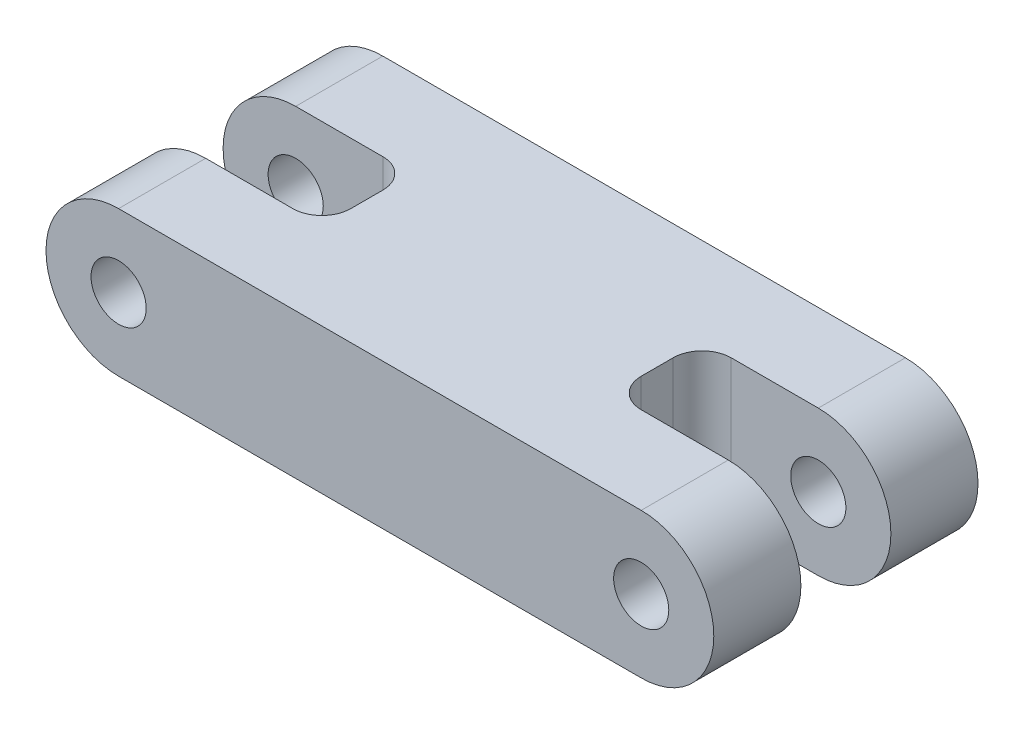
ISO-10303-21;
HEADER;
FILE_DESCRIPTION(('STEP AP214'),'2;1');
FILE_NAME('part.step','',(''),(''),'','','');
FILE_SCHEMA(('AUTOMOTIVE_DESIGN { 1 0 10303 214 1 1 1 1 }'));
ENDSEC;
DATA;
#1=APPLICATION_CONTEXT('core data for automotive mechanical design processes');
#2=APPLICATION_PROTOCOL_DEFINITION('international standard','automotive_design',2000,#1);
#3=PRODUCT_CONTEXT('',#1,'mechanical');
#4=PRODUCT('Part','Part','',(#3));
#5=PRODUCT_RELATED_PRODUCT_CATEGORY('part','',(#4));
#6=PRODUCT_DEFINITION_FORMATION('','',#4);
#7=PRODUCT_DEFINITION_CONTEXT('part definition',#1,'design');
#8=PRODUCT_DEFINITION('design','',#6,#7);
#9=PRODUCT_DEFINITION_SHAPE('','',#8);
#10=(LENGTH_UNIT() NAMED_UNIT(*) SI_UNIT(.MILLI.,.METRE.));
#11=(NAMED_UNIT(*) PLANE_ANGLE_UNIT() SI_UNIT($,.RADIAN.));
#12=(NAMED_UNIT(*) SI_UNIT($,.STERADIAN.) SOLID_ANGLE_UNIT());
#13=UNCERTAINTY_MEASURE_WITH_UNIT(LENGTH_MEASURE(1.E-05),#10,'distance_accuracy_value','');
#14=(GEOMETRIC_REPRESENTATION_CONTEXT(3) GLOBAL_UNCERTAINTY_ASSIGNED_CONTEXT((#13)) GLOBAL_UNIT_ASSIGNED_CONTEXT((#10,
#11,#12)) REPRESENTATION_CONTEXT('',''));
#15=CARTESIAN_POINT('',(0.,0.,0.));
#16=DIRECTION('',(0.,0.,1.));
#17=DIRECTION('',(1.,0.,0.));
#18=AXIS2_PLACEMENT_3D('',#15,#16,#17);
#19=CARTESIAN_POINT('',(0.,0.,-3.1));
#20=DIRECTION('',(0.,0.,-1.));
#21=DIRECTION('',(-1.,0.,0.));
#22=AXIS2_PLACEMENT_3D('',#19,#20,#21);
#23=PLANE('',#22);
#24=CARTESIAN_POINT('',(0.,0.,-3.1));
#25=DIRECTION('',(0.,0.,1.));
#26=DIRECTION('',(1.,0.,0.));
#27=AXIS2_PLACEMENT_3D('',#24,#25,#26);
#28=CIRCLE('',#27,1.9);
#29=CARTESIAN_POINT('',(1.9,0.,-3.1));
#30=VERTEX_POINT('',#29);
#31=EDGE_CURVE('E214',#30,#30,#28,.T.);
#32=ORIENTED_EDGE('',*,*,#31,.F.);
#33=EDGE_LOOP('',(#32));
#34=FACE_BOUND('',#33,.T.);
#35=DIRECTION('',(-1.,0.,0.));
#36=VECTOR('',#35,1.);
#37=CARTESIAN_POINT('',(0.,5.,-3.1));
#38=LINE('',#37,#36);
#39=CARTESIAN_POINT('',(0.,5.,-3.1));
#40=VERTEX_POINT('',#39);
#41=CARTESIAN_POINT('',(-6.,5.,-3.1));
#42=VERTEX_POINT('',#41);
#43=EDGE_CURVE('E232',#40,#42,#38,.T.);
#44=ORIENTED_EDGE('',*,*,#43,.T.);
#45=DIRECTION('',(0.,1.,0.));
#46=VECTOR('',#45,1.);
#47=CARTESIAN_POINT('',(-6.,-5.,-3.1));
#48=LINE('',#47,#46);
#49=CARTESIAN_POINT('',(-6.,-5.,-3.1));
#50=VERTEX_POINT('',#49);
#51=EDGE_CURVE('E60',#42,#50,#48,.F.);
#52=ORIENTED_EDGE('',*,*,#51,.T.);
#53=DIRECTION('',(1.,0.,0.));
#54=VECTOR('',#53,1.);
#55=CARTESIAN_POINT('',(0.,-5.,-3.1));
#56=LINE('',#55,#54);
#57=CARTESIAN_POINT('',(0.,-5.,-3.1));
#58=VERTEX_POINT('',#57);
#59=EDGE_CURVE('E236',#50,#58,#56,.T.);
#60=ORIENTED_EDGE('',*,*,#59,.T.);
#61=CARTESIAN_POINT('',(0.,0.,-3.1));
#62=DIRECTION('',(0.,0.,1.));
#63=DIRECTION('',(-1.,0.,0.));
#64=AXIS2_PLACEMENT_3D('',#61,#62,#63);
#65=CIRCLE('',#64,5.);
#66=EDGE_CURVE('E227',#58,#40,#65,.T.);
#67=ORIENTED_EDGE('',*,*,#66,.T.);
#68=EDGE_LOOP('',(#44,#52,#60,#67));
#69=FACE_BOUND('',#68,.T.);
#70=ADVANCED_FACE('F39',(#34,#69),#23,.F.);
#71=CARTESIAN_POINT('',(-36.,0.,-3.1));
#72=DIRECTION('',(0.,0.,1.));
#73=DIRECTION('',(1.,0.,0.));
#74=AXIS2_PLACEMENT_3D('',#71,#72,#73);
#75=CIRCLE('',#74,1.9);
#76=CARTESIAN_POINT('',(-34.1,0.,-3.1));
#77=VERTEX_POINT('',#76);
#78=EDGE_CURVE('E224',#77,#77,#75,.T.);
#79=ORIENTED_EDGE('',*,*,#78,.F.);
#80=EDGE_LOOP('',(#79));
#81=FACE_BOUND('',#80,.T.);
#82=CARTESIAN_POINT('',(-36.,-5.,-3.1));
#83=VERTEX_POINT('',#82);
#84=CARTESIAN_POINT('',(-30.,-5.,-3.1));
#85=VERTEX_POINT('',#84);
#86=EDGE_CURVE('E237',#83,#85,#56,.T.);
#87=ORIENTED_EDGE('',*,*,#86,.T.);
#88=DIRECTION('',(0.,-1.,0.));
#89=VECTOR('',#88,1.);
#90=CARTESIAN_POINT('',(-30.,5.,-3.1));
#91=LINE('',#90,#89);
#92=CARTESIAN_POINT('',(-30.,5.,-3.1));
#93=VERTEX_POINT('',#92);
#94=EDGE_CURVE('E269',#85,#93,#91,.F.);
#95=ORIENTED_EDGE('',*,*,#94,.T.);
#96=CARTESIAN_POINT('',(-36.,5.,-3.1));
#97=VERTEX_POINT('',#96);
#98=EDGE_CURVE('E230',#93,#97,#38,.T.);
#99=ORIENTED_EDGE('',*,*,#98,.T.);
#100=CARTESIAN_POINT('',(-36.,0.,-3.1));
#101=DIRECTION('',(0.,0.,1.));
#102=DIRECTION('',(1.,0.,0.));
#103=AXIS2_PLACEMENT_3D('',#100,#101,#102);
#104=CIRCLE('',#103,5.);
#105=EDGE_CURVE('E234',#97,#83,#104,.T.);
#106=ORIENTED_EDGE('',*,*,#105,.T.);
#107=EDGE_LOOP('',(#87,#95,#99,#106));
#108=FACE_BOUND('',#107,.T.);
#109=ADVANCED_FACE('F321',(#81,#108),#23,.F.);
#110=CARTESIAN_POINT('',(0.,0.,-3.1));
#111=DIRECTION('',(0.,0.,-1.));
#112=DIRECTION('',(-1.,0.,0.));
#113=AXIS2_PLACEMENT_3D('',#110,#111,#112);
#114=CYLINDRICAL_SURFACE('',#113,5.);
#115=CARTESIAN_POINT('',(0.,0.,-9.1));
#116=DIRECTION('',(0.,0.,1.));
#117=DIRECTION('',(-1.,0.,0.));
#118=AXIS2_PLACEMENT_3D('',#115,#116,#117);
#119=CIRCLE('',#118,5.);
#120=CARTESIAN_POINT('',(0.,-5.,-9.1));
#121=VERTEX_POINT('',#120);
#122=CARTESIAN_POINT('',(0.,5.,-9.1));
#123=VERTEX_POINT('',#122);
#124=EDGE_CURVE('E223',#121,#123,#119,.T.);
#125=ORIENTED_EDGE('',*,*,#124,.T.);
#126=DIRECTION('',(0.,0.,-1.));
#127=VECTOR('',#126,1.);
#128=CARTESIAN_POINT('',(0.,5.,-3.1));
#129=LINE('',#128,#127);
#130=EDGE_CURVE('E256',#40,#123,#129,.T.);
#131=ORIENTED_EDGE('',*,*,#130,.F.);
#132=ORIENTED_EDGE('',*,*,#66,.F.);
#133=DIRECTION('',(0.,0.,-1.));
#134=VECTOR('',#133,1.);
#135=CARTESIAN_POINT('',(0.,-5.,-3.1));
#136=LINE('',#135,#134);
#137=EDGE_CURVE('E240',#58,#121,#136,.T.);
#138=ORIENTED_EDGE('',*,*,#137,.T.);
#139=EDGE_LOOP('',(#125,#131,#132,#138));
#140=FACE_BOUND('',#139,.T.);
#141=ADVANCED_FACE('F306',(#140),#114,.T.);
#142=CARTESIAN_POINT('',(0.,5.,-3.1));
#143=DIRECTION('',(0.,-1.,0.));
#144=DIRECTION('',(1.,0.,0.));
#145=AXIS2_PLACEMENT_3D('',#142,#143,#144);
#146=PLANE('',#145);
#147=DIRECTION('',(-1.,0.,0.));
#148=VECTOR('',#147,1.);
#149=CARTESIAN_POINT('',(0.,5.,-9.1));
#150=LINE('',#149,#148);
#151=CARTESIAN_POINT('',(-36.,5.,-9.1));
#152=VERTEX_POINT('',#151);
#153=EDGE_CURVE('E243',#123,#152,#150,.T.);
#154=ORIENTED_EDGE('',*,*,#153,.T.);
#155=DIRECTION('',(0.,0.,-1.));
#156=VECTOR('',#155,1.);
#157=CARTESIAN_POINT('',(-36.,5.,-3.1));
#158=LINE('',#157,#156);
#159=EDGE_CURVE('E253',#97,#152,#158,.T.);
#160=ORIENTED_EDGE('',*,*,#159,.F.);
#161=ORIENTED_EDGE('',*,*,#98,.F.);
#162=CARTESIAN_POINT('',(-30.,5.,-1.1));
#163=DIRECTION('',(0.,-1.,0.));
#164=DIRECTION('',(1.,0.,0.));
#165=AXIS2_PLACEMENT_3D('',#162,#163,#164);
#166=CIRCLE('',#165,2.);
#167=CARTESIAN_POINT('',(-28.,5.,-1.1));
#168=VERTEX_POINT('',#167);
#169=EDGE_CURVE('E284',#93,#168,#166,.T.);
#170=ORIENTED_EDGE('',*,*,#169,.T.);
#171=DIRECTION('',(0.,0.,-1.));
#172=VECTOR('',#171,1.);
#173=CARTESIAN_POINT('',(-28.,5.,22.3606797749979));
#174=LINE('',#173,#172);
#175=CARTESIAN_POINT('',(-28.,5.,1.1));
#176=VERTEX_POINT('',#175);
#177=EDGE_CURVE('E208',#176,#168,#174,.T.);
#178=ORIENTED_EDGE('',*,*,#177,.F.);
#179=CARTESIAN_POINT('',(-30.,5.,1.1));
#180=DIRECTION('',(0.,-1.,0.));
#181=DIRECTION('',(1.,0.,0.));
#182=AXIS2_PLACEMENT_3D('',#179,#180,#181);
#183=CIRCLE('',#182,2.);
#184=CARTESIAN_POINT('',(-30.,5.,3.1));
#185=VERTEX_POINT('',#184);
#186=EDGE_CURVE('E280',#176,#185,#183,.T.);
#187=ORIENTED_EDGE('',*,*,#186,.T.);
#188=DIRECTION('',(-1.,0.,0.));
#189=VECTOR('',#188,1.);
#190=CARTESIAN_POINT('',(0.,5.,3.1));
#191=LINE('',#190,#189);
#192=CARTESIAN_POINT('',(-36.,5.,3.1));
#193=VERTEX_POINT('',#192);
#194=EDGE_CURVE('E171',#185,#193,#191,.T.);
#195=ORIENTED_EDGE('',*,*,#194,.T.);
#196=DIRECTION('',(0.,0.,1.));
#197=VECTOR('',#196,1.);
#198=CARTESIAN_POINT('',(-36.,5.,3.1));
#199=LINE('',#198,#197);
#200=CARTESIAN_POINT('',(-36.,5.,9.1));
#201=VERTEX_POINT('',#200);
#202=EDGE_CURVE('E161',#193,#201,#199,.T.);
#203=ORIENTED_EDGE('',*,*,#202,.T.);
#204=DIRECTION('',(-1.,0.,0.));
#205=VECTOR('',#204,1.);
#206=CARTESIAN_POINT('',(0.,5.,9.1));
#207=LINE('',#206,#205);
#208=CARTESIAN_POINT('',(0.,5.,9.1));
#209=VERTEX_POINT('',#208);
#210=EDGE_CURVE('E156',#209,#201,#207,.T.);
#211=ORIENTED_EDGE('',*,*,#210,.F.);
#212=DIRECTION('',(0.,0.,1.));
#213=VECTOR('',#212,1.);
#214=CARTESIAN_POINT('',(0.,5.,3.1));
#215=LINE('',#214,#213);
#216=CARTESIAN_POINT('',(0.,5.,3.1));
#217=VERTEX_POINT('',#216);
#218=EDGE_CURVE('E149',#217,#209,#215,.T.);
#219=ORIENTED_EDGE('',*,*,#218,.F.);
#220=CARTESIAN_POINT('',(-6.,5.,3.1));
#221=VERTEX_POINT('',#220);
#222=EDGE_CURVE('E153',#217,#221,#191,.T.);
#223=ORIENTED_EDGE('',*,*,#222,.T.);
#224=CARTESIAN_POINT('',(-6.,5.,1.1));
#225=DIRECTION('',(0.,-1.,0.));
#226=DIRECTION('',(1.,0.,0.));
#227=AXIS2_PLACEMENT_3D('',#224,#225,#226);
#228=CIRCLE('',#227,2.);
#229=CARTESIAN_POINT('',(-8.,5.,1.1));
#230=VERTEX_POINT('',#229);
#231=EDGE_CURVE('E286',#221,#230,#228,.T.);
#232=ORIENTED_EDGE('',*,*,#231,.T.);
#233=DIRECTION('',(0.,0.,-1.));
#234=VECTOR('',#233,1.);
#235=CARTESIAN_POINT('',(-8.,5.,22.3606797749979));
#236=LINE('',#235,#234);
#237=CARTESIAN_POINT('',(-8.,5.,-1.1));
#238=VERTEX_POINT('',#237);
#239=EDGE_CURVE('E206',#230,#238,#236,.T.);
#240=ORIENTED_EDGE('',*,*,#239,.T.);
#241=CARTESIAN_POINT('',(-6.,5.,-1.1));
#242=DIRECTION('',(0.,-1.,0.));
#243=DIRECTION('',(1.,0.,0.));
#244=AXIS2_PLACEMENT_3D('',#241,#242,#243);
#245=CIRCLE('',#244,2.);
#246=EDGE_CURVE('E47',#238,#42,#245,.T.);
#247=ORIENTED_EDGE('',*,*,#246,.T.);
#248=ORIENTED_EDGE('',*,*,#43,.F.);
#249=ORIENTED_EDGE('',*,*,#130,.T.);
#250=EDGE_LOOP('',(#154,#160,#161,#170,#178,#187,#195,#203,#211,#219,#223,#232,#240,#247,#248,#249));
#251=FACE_BOUND('',#250,.T.);
#252=ADVANCED_FACE('F151',(#251),#146,.F.);
#253=CARTESIAN_POINT('',(-36.,0.,-3.1));
#254=DIRECTION('',(0.,0.,-1.));
#255=DIRECTION('',(-1.,0.,0.));
#256=AXIS2_PLACEMENT_3D('',#253,#254,#255);
#257=CYLINDRICAL_SURFACE('',#256,5.);
#258=CARTESIAN_POINT('',(-36.,0.,-9.1));
#259=DIRECTION('',(0.,0.,1.));
#260=DIRECTION('',(1.,0.,0.));
#261=AXIS2_PLACEMENT_3D('',#258,#259,#260);
#262=CIRCLE('',#261,5.);
#263=CARTESIAN_POINT('',(-36.,-5.,-9.1));
#264=VERTEX_POINT('',#263);
#265=EDGE_CURVE('E245',#152,#264,#262,.T.);
#266=ORIENTED_EDGE('',*,*,#265,.T.);
#267=DIRECTION('',(0.,0.,-1.));
#268=VECTOR('',#267,1.);
#269=CARTESIAN_POINT('',(-36.,-5.,-3.1));
#270=LINE('',#269,#268);
#271=EDGE_CURVE('E250',#83,#264,#270,.T.);
#272=ORIENTED_EDGE('',*,*,#271,.F.);
#273=ORIENTED_EDGE('',*,*,#105,.F.);
#274=ORIENTED_EDGE('',*,*,#159,.T.);
#275=EDGE_LOOP('',(#266,#272,#273,#274));
#276=FACE_BOUND('',#275,.T.);
#277=ADVANCED_FACE('F314',(#276),#257,.T.);
#278=CARTESIAN_POINT('',(0.,-5.,-3.1));
#279=DIRECTION('',(0.,1.,0.));
#280=DIRECTION('',(-1.,0.,0.));
#281=AXIS2_PLACEMENT_3D('',#278,#279,#280);
#282=PLANE('',#281);
#283=DIRECTION('',(1.,0.,0.));
#284=VECTOR('',#283,1.);
#285=CARTESIAN_POINT('',(0.,-5.,-9.1));
#286=LINE('',#285,#284);
#287=EDGE_CURVE('E231',#264,#121,#286,.T.);
#288=ORIENTED_EDGE('',*,*,#287,.T.);
#289=ORIENTED_EDGE('',*,*,#137,.F.);
#290=ORIENTED_EDGE('',*,*,#59,.F.);
#291=CARTESIAN_POINT('',(-6.,-5.,-1.1));
#292=DIRECTION('',(0.,1.,0.));
#293=DIRECTION('',(-1.,0.,0.));
#294=AXIS2_PLACEMENT_3D('',#291,#292,#293);
#295=CIRCLE('',#294,2.);
#296=CARTESIAN_POINT('',(-8.,-5.,-1.1));
#297=VERTEX_POINT('',#296);
#298=EDGE_CURVE('E11',#50,#297,#295,.T.);
#299=ORIENTED_EDGE('',*,*,#298,.T.);
#300=DIRECTION('',(0.,0.,-1.));
#301=VECTOR('',#300,1.);
#302=CARTESIAN_POINT('',(-8.,-5.,22.3606797749979));
#303=LINE('',#302,#301);
#304=CARTESIAN_POINT('',(-8.,-5.,1.1));
#305=VERTEX_POINT('',#304);
#306=EDGE_CURVE('E160',#305,#297,#303,.T.);
#307=ORIENTED_EDGE('',*,*,#306,.F.);
#308=CARTESIAN_POINT('',(-6.,-5.,1.1));
#309=DIRECTION('',(0.,1.,0.));
#310=DIRECTION('',(-1.,0.,0.));
#311=AXIS2_PLACEMENT_3D('',#308,#309,#310);
#312=CIRCLE('',#311,2.);
#313=CARTESIAN_POINT('',(-6.,-5.,3.1));
#314=VERTEX_POINT('',#313);
#315=EDGE_CURVE('E288',#305,#314,#312,.T.);
#316=ORIENTED_EDGE('',*,*,#315,.T.);
#317=DIRECTION('',(1.,0.,0.));
#318=VECTOR('',#317,1.);
#319=CARTESIAN_POINT('',(0.,-5.,3.1));
#320=LINE('',#319,#318);
#321=CARTESIAN_POINT('',(0.,-5.,3.1));
#322=VERTEX_POINT('',#321);
#323=EDGE_CURVE('E181',#314,#322,#320,.T.);
#324=ORIENTED_EDGE('',*,*,#323,.T.);
#325=DIRECTION('',(0.,0.,1.));
#326=VECTOR('',#325,1.);
#327=CARTESIAN_POINT('',(0.,-5.,3.1));
#328=LINE('',#327,#326);
#329=CARTESIAN_POINT('',(0.,-5.,9.1));
#330=VERTEX_POINT('',#329);
#331=EDGE_CURVE('E168',#322,#330,#328,.T.);
#332=ORIENTED_EDGE('',*,*,#331,.T.);
#333=DIRECTION('',(1.,0.,0.));
#334=VECTOR('',#333,1.);
#335=CARTESIAN_POINT('',(0.,-5.,9.1));
#336=LINE('',#335,#334);
#337=CARTESIAN_POINT('',(-36.,-5.,9.1));
#338=VERTEX_POINT('',#337);
#339=EDGE_CURVE('E172',#338,#330,#336,.T.);
#340=ORIENTED_EDGE('',*,*,#339,.F.);
#341=DIRECTION('',(0.,0.,1.));
#342=VECTOR('',#341,1.);
#343=CARTESIAN_POINT('',(-36.,-5.,3.1));
#344=LINE('',#343,#342);
#345=CARTESIAN_POINT('',(-36.,-5.,3.1));
#346=VERTEX_POINT('',#345);
#347=EDGE_CURVE('E197',#346,#338,#344,.T.);
#348=ORIENTED_EDGE('',*,*,#347,.F.);
#349=CARTESIAN_POINT('',(-30.,-5.,3.1));
#350=VERTEX_POINT('',#349);
#351=EDGE_CURVE('E185',#346,#350,#320,.T.);
#352=ORIENTED_EDGE('',*,*,#351,.T.);
#353=CARTESIAN_POINT('',(-30.,-5.,1.1));
#354=DIRECTION('',(0.,1.,0.));
#355=DIRECTION('',(-1.,0.,0.));
#356=AXIS2_PLACEMENT_3D('',#353,#354,#355);
#357=CIRCLE('',#356,2.);
#358=CARTESIAN_POINT('',(-28.,-5.,1.1));
#359=VERTEX_POINT('',#358);
#360=EDGE_CURVE('E278',#350,#359,#357,.T.);
#361=ORIENTED_EDGE('',*,*,#360,.T.);
#362=DIRECTION('',(0.,0.,-1.));
#363=VECTOR('',#362,1.);
#364=CARTESIAN_POINT('',(-28.,-5.,22.3606797749979));
#365=LINE('',#364,#363);
#366=CARTESIAN_POINT('',(-28.,-5.,-1.1));
#367=VERTEX_POINT('',#366);
#368=EDGE_CURVE('E211',#359,#367,#365,.T.);
#369=ORIENTED_EDGE('',*,*,#368,.T.);
#370=CARTESIAN_POINT('',(-30.,-5.,-1.1));
#371=DIRECTION('',(0.,1.,0.));
#372=DIRECTION('',(-1.,0.,0.));
#373=AXIS2_PLACEMENT_3D('',#370,#371,#372);
#374=CIRCLE('',#373,2.);
#375=EDGE_CURVE('E282',#367,#85,#374,.T.);
#376=ORIENTED_EDGE('',*,*,#375,.T.);
#377=ORIENTED_EDGE('',*,*,#86,.F.);
#378=ORIENTED_EDGE('',*,*,#271,.T.);
#379=EDGE_LOOP('',(#288,#289,#290,#299,#307,#316,#324,#332,#340,#348,#352,#361,#369,#376,#377,#378));
#380=FACE_BOUND('',#379,.T.);
#381=ADVANCED_FACE('F292',(#380),#282,.F.);
#382=CARTESIAN_POINT('',(0.,0.,-9.1));
#383=DIRECTION('',(0.,0.,-1.));
#384=DIRECTION('',(-1.,0.,0.));
#385=AXIS2_PLACEMENT_3D('',#382,#383,#384);
#386=PLANE('',#385);
#387=CARTESIAN_POINT('',(0.,0.,-9.1));
#388=DIRECTION('',(0.,0.,-1.));
#389=DIRECTION('',(-1.,0.,0.));
#390=AXIS2_PLACEMENT_3D('',#387,#388,#389);
#391=CIRCLE('',#390,1.9);
#392=CARTESIAN_POINT('',(-1.9,0.,-9.1));
#393=VERTEX_POINT('',#392);
#394=EDGE_CURVE('E219',#393,#393,#391,.T.);
#395=ORIENTED_EDGE('',*,*,#394,.F.);
#396=EDGE_LOOP('',(#395));
#397=FACE_BOUND('',#396,.T.);
#398=CARTESIAN_POINT('',(-36.,0.,-9.1));
#399=DIRECTION('',(0.,0.,1.));
#400=DIRECTION('',(1.,0.,0.));
#401=AXIS2_PLACEMENT_3D('',#398,#399,#400);
#402=CIRCLE('',#401,1.9);
#403=CARTESIAN_POINT('',(-34.1,0.,-9.1));
#404=VERTEX_POINT('',#403);
#405=EDGE_CURVE('E220',#404,#404,#402,.T.);
#406=ORIENTED_EDGE('',*,*,#405,.T.);
#407=EDGE_LOOP('',(#406));
#408=FACE_BOUND('',#407,.T.);
#409=ORIENTED_EDGE('',*,*,#124,.F.);
#410=ORIENTED_EDGE('',*,*,#287,.F.);
#411=ORIENTED_EDGE('',*,*,#265,.F.);
#412=ORIENTED_EDGE('',*,*,#153,.F.);
#413=EDGE_LOOP('',(#409,#410,#411,#412));
#414=FACE_BOUND('',#413,.T.);
#415=ADVANCED_FACE('F317',(#397,#408,#414),#386,.T.);
#416=CARTESIAN_POINT('',(-36.,0.,-9.1));
#417=DIRECTION('',(0.,0.,1.));
#418=DIRECTION('',(1.,0.,0.));
#419=AXIS2_PLACEMENT_3D('',#416,#417,#418);
#420=CYLINDRICAL_SURFACE('',#419,1.9);
#421=ORIENTED_EDGE('',*,*,#405,.F.);
#422=EDGE_LOOP('',(#421));
#423=FACE_BOUND('',#422,.T.);
#424=ORIENTED_EDGE('',*,*,#78,.T.);
#425=EDGE_LOOP('',(#424));
#426=FACE_BOUND('',#425,.T.);
#427=ADVANCED_FACE('F369',(#423,#426),#420,.F.);
#428=CARTESIAN_POINT('',(0.,0.,-13.1));
#429=DIRECTION('',(0.,0.,1.));
#430=DIRECTION('',(1.,0.,0.));
#431=AXIS2_PLACEMENT_3D('',#428,#429,#430);
#432=CYLINDRICAL_SURFACE('',#431,1.9);
#433=ORIENTED_EDGE('',*,*,#394,.T.);
#434=EDGE_LOOP('',(#433));
#435=FACE_BOUND('',#434,.T.);
#436=ORIENTED_EDGE('',*,*,#31,.T.);
#437=EDGE_LOOP('',(#436));
#438=FACE_BOUND('',#437,.T.);
#439=ADVANCED_FACE('F451',(#435,#438),#432,.F.);
#440=CARTESIAN_POINT('',(-8.,5.,22.3606797749979));
#441=DIRECTION('',(-1.,0.,0.));
#442=DIRECTION('',(0.,0.,1.));
#443=AXIS2_PLACEMENT_3D('',#440,#441,#442);
#444=PLANE('',#443);
#445=ORIENTED_EDGE('',*,*,#239,.F.);
#446=DIRECTION('',(0.,1.,0.));
#447=VECTOR('',#446,1.);
#448=CARTESIAN_POINT('',(-8.,-5.,1.1));
#449=LINE('',#448,#447);
#450=EDGE_CURVE('E275',#230,#305,#449,.F.);
#451=ORIENTED_EDGE('',*,*,#450,.T.);
#452=ORIENTED_EDGE('',*,*,#306,.T.);
#453=DIRECTION('',(0.,1.,0.));
#454=VECTOR('',#453,1.);
#455=CARTESIAN_POINT('',(-8.,5.,-1.1));
#456=LINE('',#455,#454);
#457=EDGE_CURVE('E272',#297,#238,#456,.T.);
#458=ORIENTED_EDGE('',*,*,#457,.T.);
#459=EDGE_LOOP('',(#445,#451,#452,#458));
#460=FACE_BOUND('',#459,.T.);
#461=ADVANCED_FACE('F298',(#460),#444,.F.);
#462=CARTESIAN_POINT('',(-28.,5.,22.3606797749979));
#463=DIRECTION('',(1.,0.,0.));
#464=DIRECTION('',(0.,0.,-1.));
#465=AXIS2_PLACEMENT_3D('',#462,#463,#464);
#466=PLANE('',#465);
#467=ORIENTED_EDGE('',*,*,#368,.F.);
#468=DIRECTION('',(0.,-1.,0.));
#469=VECTOR('',#468,1.);
#470=CARTESIAN_POINT('',(-28.,5.,1.1));
#471=LINE('',#470,#469);
#472=EDGE_CURVE('E267',#359,#176,#471,.F.);
#473=ORIENTED_EDGE('',*,*,#472,.T.);
#474=ORIENTED_EDGE('',*,*,#177,.T.);
#475=DIRECTION('',(0.,-1.,0.));
#476=VECTOR('',#475,1.);
#477=CARTESIAN_POINT('',(-28.,-5.,-1.1));
#478=LINE('',#477,#476);
#479=EDGE_CURVE('E264',#168,#367,#478,.T.);
#480=ORIENTED_EDGE('',*,*,#479,.T.);
#481=EDGE_LOOP('',(#467,#473,#474,#480));
#482=FACE_BOUND('',#481,.T.);
#483=ADVANCED_FACE('F330',(#482),#466,.F.);
#484=CARTESIAN_POINT('',(0.,0.,3.1));
#485=DIRECTION('',(0.,0.,1.));
#486=DIRECTION('',(-1.,0.,0.));
#487=AXIS2_PLACEMENT_3D('',#484,#485,#486);
#488=PLANE('',#487);
#489=CARTESIAN_POINT('',(0.,0.,3.1));
#490=DIRECTION('',(0.,0.,1.));
#491=DIRECTION('',(1.,0.,0.));
#492=AXIS2_PLACEMENT_3D('',#489,#490,#491);
#493=CIRCLE('',#492,1.9);
#494=CARTESIAN_POINT('',(1.9,0.,3.1));
#495=VERTEX_POINT('',#494);
#496=EDGE_CURVE('E205',#495,#495,#493,.T.);
#497=ORIENTED_EDGE('',*,*,#496,.T.);
#498=EDGE_LOOP('',(#497));
#499=FACE_BOUND('',#498,.T.);
#500=ORIENTED_EDGE('',*,*,#323,.F.);
#501=DIRECTION('',(0.,1.,0.));
#502=VECTOR('',#501,1.);
#503=CARTESIAN_POINT('',(-6.,5.,3.1));
#504=LINE('',#503,#502);
#505=EDGE_CURVE('E177',#314,#221,#504,.T.);
#506=ORIENTED_EDGE('',*,*,#505,.T.);
#507=ORIENTED_EDGE('',*,*,#222,.F.);
#508=CARTESIAN_POINT('',(0.,0.,3.1));
#509=DIRECTION('',(0.,0.,1.));
#510=DIRECTION('',(-1.,0.,0.));
#511=AXIS2_PLACEMENT_3D('',#508,#509,#510);
#512=CIRCLE('',#511,5.);
#513=EDGE_CURVE('E165',#322,#217,#512,.T.);
#514=ORIENTED_EDGE('',*,*,#513,.F.);
#515=EDGE_LOOP('',(#500,#506,#507,#514));
#516=FACE_BOUND('',#515,.T.);
#517=ADVANCED_FACE('F175',(#499,#516),#488,.F.);
#518=CARTESIAN_POINT('',(-36.,0.,3.1));
#519=DIRECTION('',(0.,0.,1.));
#520=DIRECTION('',(1.,0.,0.));
#521=AXIS2_PLACEMENT_3D('',#518,#519,#520);
#522=CIRCLE('',#521,1.9);
#523=CARTESIAN_POINT('',(-34.1,0.,3.1));
#524=VERTEX_POINT('',#523);
#525=EDGE_CURVE('E204',#524,#524,#522,.T.);
#526=ORIENTED_EDGE('',*,*,#525,.T.);
#527=EDGE_LOOP('',(#526));
#528=FACE_BOUND('',#527,.T.);
#529=ORIENTED_EDGE('',*,*,#194,.F.);
#530=DIRECTION('',(0.,-1.,0.));
#531=VECTOR('',#530,1.);
#532=CARTESIAN_POINT('',(-30.,-5.,3.1));
#533=LINE('',#532,#531);
#534=EDGE_CURVE('E259',#185,#350,#533,.T.);
#535=ORIENTED_EDGE('',*,*,#534,.T.);
#536=ORIENTED_EDGE('',*,*,#351,.F.);
#537=CARTESIAN_POINT('',(-36.,0.,3.1));
#538=DIRECTION('',(0.,0.,1.));
#539=DIRECTION('',(1.,0.,0.));
#540=AXIS2_PLACEMENT_3D('',#537,#538,#539);
#541=CIRCLE('',#540,5.);
#542=EDGE_CURVE('E178',#193,#346,#541,.T.);
#543=ORIENTED_EDGE('',*,*,#542,.F.);
#544=EDGE_LOOP('',(#529,#535,#536,#543));
#545=FACE_BOUND('',#544,.T.);
#546=ADVANCED_FACE('F339',(#528,#545),#488,.F.);
#547=CARTESIAN_POINT('',(0.,0.,3.1));
#548=DIRECTION('',(0.,0.,1.));
#549=DIRECTION('',(-1.,0.,0.));
#550=AXIS2_PLACEMENT_3D('',#547,#548,#549);
#551=CYLINDRICAL_SURFACE('',#550,5.);
#552=CARTESIAN_POINT('',(0.,0.,9.1));
#553=DIRECTION('',(0.,0.,1.));
#554=DIRECTION('',(-1.,0.,0.));
#555=AXIS2_PLACEMENT_3D('',#552,#553,#554);
#556=CIRCLE('',#555,5.);
#557=EDGE_CURVE('E188',#330,#209,#556,.T.);
#558=ORIENTED_EDGE('',*,*,#557,.F.);
#559=ORIENTED_EDGE('',*,*,#331,.F.);
#560=ORIENTED_EDGE('',*,*,#513,.T.);
#561=ORIENTED_EDGE('',*,*,#218,.T.);
#562=EDGE_LOOP('',(#558,#559,#560,#561));
#563=FACE_BOUND('',#562,.T.);
#564=ADVANCED_FACE('F166',(#563),#551,.T.);
#565=CARTESIAN_POINT('',(-36.,0.,3.1));
#566=DIRECTION('',(0.,0.,1.));
#567=DIRECTION('',(-1.,0.,0.));
#568=AXIS2_PLACEMENT_3D('',#565,#566,#567);
#569=CYLINDRICAL_SURFACE('',#568,5.);
#570=CARTESIAN_POINT('',(-36.,0.,9.1));
#571=DIRECTION('',(0.,0.,1.));
#572=DIRECTION('',(1.,0.,0.));
#573=AXIS2_PLACEMENT_3D('',#570,#571,#572);
#574=CIRCLE('',#573,5.);
#575=EDGE_CURVE('E192',#201,#338,#574,.T.);
#576=ORIENTED_EDGE('',*,*,#575,.F.);
#577=ORIENTED_EDGE('',*,*,#202,.F.);
#578=ORIENTED_EDGE('',*,*,#542,.T.);
#579=ORIENTED_EDGE('',*,*,#347,.T.);
#580=EDGE_LOOP('',(#576,#577,#578,#579));
#581=FACE_BOUND('',#580,.T.);
#582=ADVANCED_FACE('F342',(#581),#569,.T.);
#583=CARTESIAN_POINT('',(0.,0.,9.1));
#584=DIRECTION('',(0.,0.,1.));
#585=DIRECTION('',(-1.,0.,0.));
#586=AXIS2_PLACEMENT_3D('',#583,#584,#585);
#587=PLANE('',#586);
#588=CARTESIAN_POINT('',(0.,0.,9.1));
#589=DIRECTION('',(0.,0.,-1.));
#590=DIRECTION('',(-1.,0.,0.));
#591=AXIS2_PLACEMENT_3D('',#588,#589,#590);
#592=CIRCLE('',#591,1.9);
#593=CARTESIAN_POINT('',(-1.9,0.,9.1));
#594=VERTEX_POINT('',#593);
#595=EDGE_CURVE('E201',#594,#594,#592,.T.);
#596=ORIENTED_EDGE('',*,*,#595,.T.);
#597=EDGE_LOOP('',(#596));
#598=FACE_BOUND('',#597,.T.);
#599=CARTESIAN_POINT('',(-36.,0.,9.1));
#600=DIRECTION('',(0.,0.,1.));
#601=DIRECTION('',(1.,0.,0.));
#602=AXIS2_PLACEMENT_3D('',#599,#600,#601);
#603=CIRCLE('',#602,1.9);
#604=CARTESIAN_POINT('',(-34.1,0.,9.1));
#605=VERTEX_POINT('',#604);
#606=EDGE_CURVE('E190',#605,#605,#603,.T.);
#607=ORIENTED_EDGE('',*,*,#606,.F.);
#608=EDGE_LOOP('',(#607));
#609=FACE_BOUND('',#608,.T.);
#610=ORIENTED_EDGE('',*,*,#557,.T.);
#611=ORIENTED_EDGE('',*,*,#210,.T.);
#612=ORIENTED_EDGE('',*,*,#575,.T.);
#613=ORIENTED_EDGE('',*,*,#339,.T.);
#614=EDGE_LOOP('',(#610,#611,#612,#613));
#615=FACE_BOUND('',#614,.T.);
#616=ADVANCED_FACE('F344',(#598,#609,#615),#587,.T.);
#617=CARTESIAN_POINT('',(-36.,0.,9.1));
#618=DIRECTION('',(0.,0.,-1.));
#619=DIRECTION('',(1.,0.,0.));
#620=AXIS2_PLACEMENT_3D('',#617,#618,#619);
#621=CYLINDRICAL_SURFACE('',#620,1.9);
#622=ORIENTED_EDGE('',*,*,#606,.T.);
#623=EDGE_LOOP('',(#622));
#624=FACE_BOUND('',#623,.T.);
#625=ORIENTED_EDGE('',*,*,#525,.F.);
#626=EDGE_LOOP('',(#625));
#627=FACE_BOUND('',#626,.T.);
#628=ADVANCED_FACE('F346',(#624,#627),#621,.F.);
#629=CARTESIAN_POINT('',(0.,0.,13.1));
#630=DIRECTION('',(0.,0.,-1.));
#631=DIRECTION('',(1.,0.,0.));
#632=AXIS2_PLACEMENT_3D('',#629,#630,#631);
#633=CYLINDRICAL_SURFACE('',#632,1.9);
#634=ORIENTED_EDGE('',*,*,#595,.F.);
#635=EDGE_LOOP('',(#634));
#636=FACE_BOUND('',#635,.T.);
#637=ORIENTED_EDGE('',*,*,#496,.F.);
#638=EDGE_LOOP('',(#637));
#639=FACE_BOUND('',#638,.T.);
#640=ADVANCED_FACE('F353',(#636,#639),#633,.F.);
#641=CARTESIAN_POINT('',(-30.,0.,1.1));
#642=DIRECTION('',(0.,1.,0.));
#643=DIRECTION('',(0.,0.,1.));
#644=AXIS2_PLACEMENT_3D('',#641,#642,#643);
#645=CYLINDRICAL_SURFACE('',#644,2.);
#646=ORIENTED_EDGE('',*,*,#186,.F.);
#647=ORIENTED_EDGE('',*,*,#472,.F.);
#648=ORIENTED_EDGE('',*,*,#360,.F.);
#649=ORIENTED_EDGE('',*,*,#534,.F.);
#650=EDGE_LOOP('',(#646,#647,#648,#649));
#651=FACE_BOUND('',#650,.T.);
#652=ADVANCED_FACE('F333',(#651),#645,.F.);
#653=CARTESIAN_POINT('',(-30.,5.,-1.1));
#654=DIRECTION('',(0.,1.,0.));
#655=DIRECTION('',(0.,0.,1.));
#656=AXIS2_PLACEMENT_3D('',#653,#654,#655);
#657=CYLINDRICAL_SURFACE('',#656,2.);
#658=ORIENTED_EDGE('',*,*,#169,.F.);
#659=ORIENTED_EDGE('',*,*,#94,.F.);
#660=ORIENTED_EDGE('',*,*,#375,.F.);
#661=ORIENTED_EDGE('',*,*,#479,.F.);
#662=EDGE_LOOP('',(#658,#659,#660,#661));
#663=FACE_BOUND('',#662,.T.);
#664=ADVANCED_FACE('F324',(#663),#657,.F.);
#665=CARTESIAN_POINT('',(-6.,0.,1.1));
#666=DIRECTION('',(0.,-1.,0.));
#667=DIRECTION('',(0.,0.,-1.));
#668=AXIS2_PLACEMENT_3D('',#665,#666,#667);
#669=CYLINDRICAL_SURFACE('',#668,2.);
#670=ORIENTED_EDGE('',*,*,#315,.F.);
#671=ORIENTED_EDGE('',*,*,#450,.F.);
#672=ORIENTED_EDGE('',*,*,#231,.F.);
#673=ORIENTED_EDGE('',*,*,#505,.F.);
#674=EDGE_LOOP('',(#670,#671,#672,#673));
#675=FACE_BOUND('',#674,.T.);
#676=ADVANCED_FACE('F295',(#675),#669,.F.);
#677=CARTESIAN_POINT('',(-6.,5.,-1.1));
#678=DIRECTION('',(0.,-1.,0.));
#679=DIRECTION('',(0.,0.,-1.));
#680=AXIS2_PLACEMENT_3D('',#677,#678,#679);
#681=CYLINDRICAL_SURFACE('',#680,2.);
#682=ORIENTED_EDGE('',*,*,#298,.F.);
#683=ORIENTED_EDGE('',*,*,#51,.F.);
#684=ORIENTED_EDGE('',*,*,#246,.F.);
#685=ORIENTED_EDGE('',*,*,#457,.F.);
#686=EDGE_LOOP('',(#682,#683,#684,#685));
#687=FACE_BOUND('',#686,.T.);
#688=ADVANCED_FACE('F41',(#687),#681,.F.);
#689=CLOSED_SHELL('',(#70,#109,#141,#252,#277,#381,#415,#427,#439,#461,#483,#517,#546,#564,#582,
#616,#628,#640,#652,#664,#676,#688));
#690=MANIFOLD_SOLID_BREP('B2',#689);
#691=ADVANCED_BREP_SHAPE_REPRESENTATION('',(#18,#690),#14);
#692=SHAPE_DEFINITION_REPRESENTATION(#9,#691);
ENDSEC;
END-ISO-10303-21;
